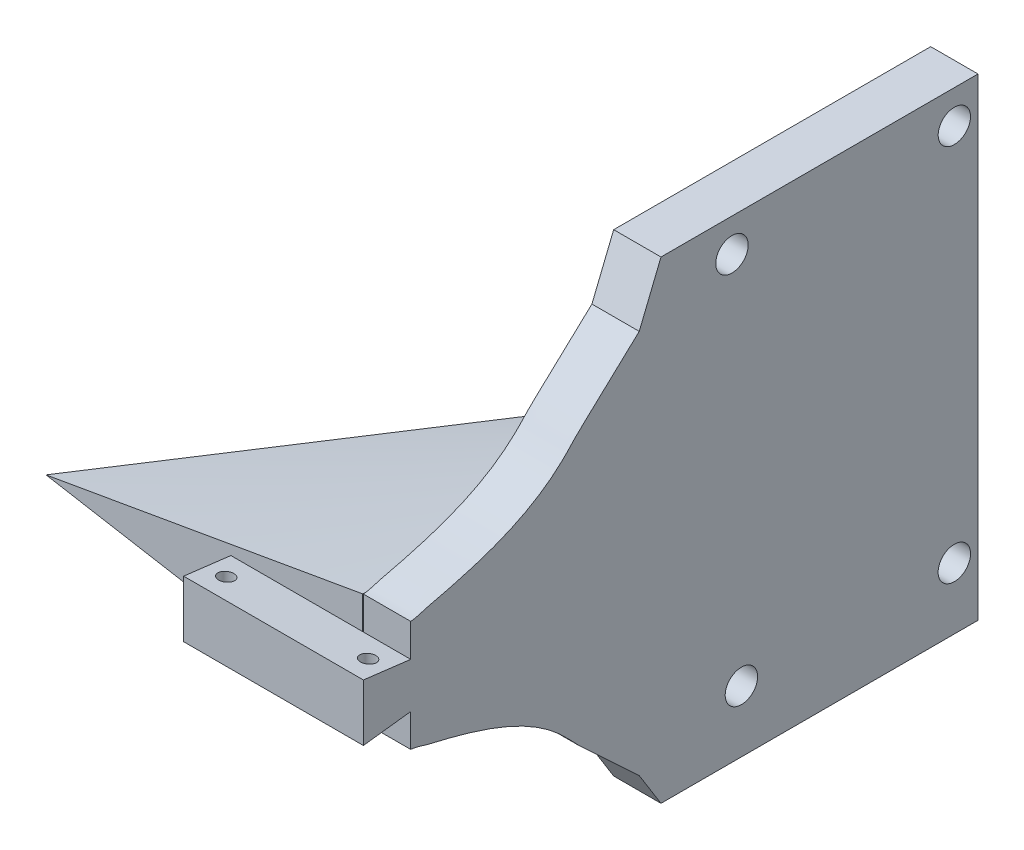
ISO-10303-21;
HEADER;
FILE_DESCRIPTION(('STEP AP214'),'2;1');
FILE_NAME('part.step','',(''),(''),'','','');
FILE_SCHEMA(('AUTOMOTIVE_DESIGN { 1 0 10303 214 1 1 1 1 }'));
ENDSEC;
DATA;
#1=APPLICATION_CONTEXT('core data for automotive mechanical design processes');
#2=APPLICATION_PROTOCOL_DEFINITION('international standard','automotive_design',2000,#1);
#3=PRODUCT_CONTEXT('',#1,'mechanical');
#4=PRODUCT('Part','Part','',(#3));
#5=PRODUCT_RELATED_PRODUCT_CATEGORY('part','',(#4));
#6=PRODUCT_DEFINITION_FORMATION('','',#4);
#7=PRODUCT_DEFINITION_CONTEXT('part definition',#1,'design');
#8=PRODUCT_DEFINITION('design','',#6,#7);
#9=PRODUCT_DEFINITION_SHAPE('','',#8);
#10=(LENGTH_UNIT() NAMED_UNIT(*) SI_UNIT(.MILLI.,.METRE.));
#11=(NAMED_UNIT(*) PLANE_ANGLE_UNIT() SI_UNIT($,.RADIAN.));
#12=(NAMED_UNIT(*) SI_UNIT($,.STERADIAN.) SOLID_ANGLE_UNIT());
#13=UNCERTAINTY_MEASURE_WITH_UNIT(LENGTH_MEASURE(1.E-05),#10,'distance_accuracy_value','');
#14=(GEOMETRIC_REPRESENTATION_CONTEXT(3) GLOBAL_UNCERTAINTY_ASSIGNED_CONTEXT((#13)) GLOBAL_UNIT_ASSIGNED_CONTEXT((#10,
#11,#12)) REPRESENTATION_CONTEXT('',''));
#15=CARTESIAN_POINT('',(0.,0.,0.));
#16=DIRECTION('',(0.,0.,1.));
#17=DIRECTION('',(1.,0.,0.));
#18=AXIS2_PLACEMENT_3D('',#15,#16,#17);
#19=CARTESIAN_POINT('',(-26.8770812291535,4.77215439097134,4.87201612799886E-13));
#20=DIRECTION('',(0.,0.,-1.));
#21=DIRECTION('',(-1.,0.,0.));
#22=AXIS2_PLACEMENT_3D('',#19,#20,#21);
#23=PLANE('',#22);
#24=DIRECTION('',(1.,0.,0.));
#25=VECTOR('',#24,1.);
#26=CARTESIAN_POINT('',(-26.8770812291536,-4.7721543909707,4.86032772079898E-13));
#27=LINE('',#26,#25);
#28=CARTESIAN_POINT('',(0.962918770845578,-4.77215439097103,0.));
#29=VERTEX_POINT('',#28);
#30=CARTESIAN_POINT('',(1.12291877084637,-4.77215439097103,0.));
#31=VERTEX_POINT('',#30);
#32=EDGE_CURVE('E214',#29,#31,#27,.T.);
#33=ORIENTED_EDGE('',*,*,#32,.F.);
#34=DIRECTION('',(0.,1.,0.));
#35=VECTOR('',#34,1.);
#36=CARTESIAN_POINT('',(0.96291877084558,-7.35277027721134,0.));
#37=LINE('',#36,#35);
#38=CARTESIAN_POINT('',(0.962918770845582,4.77215439097101,0.));
#39=VERTEX_POINT('',#38);
#40=EDGE_CURVE('E221',#29,#39,#37,.T.);
#41=ORIENTED_EDGE('',*,*,#40,.T.);
#42=DIRECTION('',(1.,0.,0.));
#43=VECTOR('',#42,1.);
#44=CARTESIAN_POINT('',(-26.8770812291535,4.77215439097134,4.87201612799886E-13));
#45=LINE('',#44,#43);
#46=CARTESIAN_POINT('',(1.12291877084638,4.77215439097101,0.));
#47=VERTEX_POINT('',#46);
#48=EDGE_CURVE('E676',#39,#47,#45,.T.);
#49=ORIENTED_EDGE('',*,*,#48,.T.);
#50=DIRECTION('',(0.,-1.,0.));
#51=VECTOR('',#50,1.);
#52=CARTESIAN_POINT('',(1.12291877084638,-11.7212844616731,0.));
#53=LINE('',#52,#51);
#54=EDGE_CURVE('E574',#47,#31,#53,.T.);
#55=ORIENTED_EDGE('',*,*,#54,.T.);
#56=EDGE_LOOP('',(#33,#41,#49,#55));
#57=FACE_BOUND('',#56,.T.);
#58=ADVANCED_FACE('F201',(#57),#23,.T.);
#59=CARTESIAN_POINT('',(1.12291877084638,-11.7212844616731,0.));
#60=DIRECTION('',(0.,0.,1.));
#61=DIRECTION('',(1.,0.,0.));
#62=AXIS2_PLACEMENT_3D('',#59,#60,#61);
#63=PLANE('',#62);
#64=CARTESIAN_POINT('',(1.12291877084638,11.7212844616731,0.));
#65=VERTEX_POINT('',#64);
#66=EDGE_CURVE('E590',#65,#47,#53,.T.);
#67=ORIENTED_EDGE('',*,*,#66,.T.);
#68=CARTESIAN_POINT('',(11.1229187708464,4.77215439097112,0.));
#69=VERTEX_POINT('',#68);
#70=EDGE_CURVE('E211',#47,#69,#45,.T.);
#71=ORIENTED_EDGE('',*,*,#70,.T.);
#72=DIRECTION('',(0.,-1.,0.));
#73=VECTOR('',#72,1.);
#74=CARTESIAN_POINT('',(11.1229187708464,-11.7212844616731,0.));
#75=LINE('',#74,#73);
#76=CARTESIAN_POINT('',(11.1229187708464,11.7212844616731,0.));
#77=VERTEX_POINT('',#76);
#78=EDGE_CURVE('E572',#77,#69,#75,.T.);
#79=ORIENTED_EDGE('',*,*,#78,.F.);
#80=DIRECTION('',(1.,0.,0.));
#81=VECTOR('',#80,1.);
#82=CARTESIAN_POINT('',(1.12291877084638,11.7212844616731,0.));
#83=LINE('',#82,#81);
#84=EDGE_CURVE('E519',#65,#77,#83,.T.);
#85=ORIENTED_EDGE('',*,*,#84,.F.);
#86=EDGE_LOOP('',(#67,#71,#79,#85));
#87=FACE_BOUND('',#86,.T.);
#88=ADVANCED_FACE('F465',(#87),#63,.T.);
#89=CARTESIAN_POINT('',(11.1229187708464,-4.77215439097115,-2.02794304362982E-13));
#90=VERTEX_POINT('',#89);
#91=EDGE_CURVE('E12',#31,#90,#27,.T.);
#92=ORIENTED_EDGE('',*,*,#91,.F.);
#93=CARTESIAN_POINT('',(1.12291877084638,-11.7212844616731,0.));
#94=VERTEX_POINT('',#93);
#95=EDGE_CURVE('E205',#31,#94,#53,.T.);
#96=ORIENTED_EDGE('',*,*,#95,.T.);
#97=DIRECTION('',(1.,0.,0.));
#98=VECTOR('',#97,1.);
#99=CARTESIAN_POINT('',(1.12291877084638,-11.7212844616731,0.));
#100=LINE('',#99,#98);
#101=CARTESIAN_POINT('',(11.1229187708464,-11.7212844616731,0.));
#102=VERTEX_POINT('',#101);
#103=EDGE_CURVE('E553',#94,#102,#100,.T.);
#104=ORIENTED_EDGE('',*,*,#103,.T.);
#105=EDGE_CURVE('E570',#90,#102,#75,.T.);
#106=ORIENTED_EDGE('',*,*,#105,.F.);
#107=EDGE_LOOP('',(#92,#96,#104,#106));
#108=FACE_BOUND('',#107,.T.);
#109=ADVANCED_FACE('F470',(#108),#63,.T.);
#110=CARTESIAN_POINT('',(1.12291877084604,-40.6534142219299,-48.2960542107961));
#111=DIRECTION('',(0.,-0.528663777933964,0.848831320051628));
#112=DIRECTION('',(0.,-0.848831320051628,-0.528663777933964));
#113=AXIS2_PLACEMENT_3D('',#110,#111,#112);
#114=PLANE('',#113);
#115=CARTESIAN_POINT('',(11.122918770846,-40.6534142219299,-48.2960542107962));
#116=CARTESIAN_POINT('',(11.122918770846,-48.0309105660179,-52.8908600300753));
#117=B_SPLINE_CURVE_WITH_KNOTS('',1,(#115,#116),.UNSPECIFIED.,.F.,.F.,(2,2),(0.,1.),.UNSPECIFIED.);
#118=CARTESIAN_POINT('',(11.122918770846,-40.6534142219299,-48.2960542107962));
#119=VERTEX_POINT('',#118);
#120=CARTESIAN_POINT('',(11.122918770846,-48.0309105660179,-52.8908600300753));
#121=VERTEX_POINT('',#120);
#122=EDGE_CURVE('E569',#119,#121,#117,.T.);
#123=ORIENTED_EDGE('',*,*,#122,.F.);
#124=DIRECTION('',(1.,0.,0.));
#125=VECTOR('',#124,1.);
#126=CARTESIAN_POINT('',(1.12291877084604,-40.6534142219299,-48.2960542107961));
#127=LINE('',#126,#125);
#128=CARTESIAN_POINT('',(1.12291877084604,-40.6534142219299,-48.2960542107961));
#129=VERTEX_POINT('',#128);
#130=EDGE_CURVE('E520',#129,#119,#127,.T.);
#131=ORIENTED_EDGE('',*,*,#130,.F.);
#132=CARTESIAN_POINT('',(1.12291877084604,-40.6534142219299,-48.2960542107961));
#133=CARTESIAN_POINT('',(1.12291877084601,-48.0309105660179,-52.8908600300753));
#134=B_SPLINE_CURVE_WITH_KNOTS('',1,(#132,#133),.UNSPECIFIED.,.F.,.F.,(2,2),(0.,1.),.UNSPECIFIED.);
#135=CARTESIAN_POINT('',(1.12291877084601,-48.0309105660179,-52.8908600300753));
#136=VERTEX_POINT('',#135);
#137=EDGE_CURVE('E547',#129,#136,#134,.T.);
#138=ORIENTED_EDGE('',*,*,#137,.T.);
#139=DIRECTION('',(1.,0.,0.));
#140=VECTOR('',#139,1.);
#141=CARTESIAN_POINT('',(1.12291877084601,-48.0309105660179,-52.8908600300753));
#142=LINE('',#141,#140);
#143=EDGE_CURVE('E552',#136,#121,#142,.T.);
#144=ORIENTED_EDGE('',*,*,#143,.T.);
#145=EDGE_LOOP('',(#123,#131,#138,#144));
#146=FACE_BOUND('',#145,.T.);
#147=ADVANCED_FACE('F486',(#146),#114,.T.);
#148=CARTESIAN_POINT('',(1.12291877084638,-11.7212844616731,0.));
#149=CARTESIAN_POINT('',(1.12291877084637,-11.7957609670483,-1.05679071993206));
#150=CARTESIAN_POINT('',(1.12291877084635,-12.5699102613416,-3.1771284252955));
#151=CARTESIAN_POINT('',(1.12291877084633,-13.1768755470558,-6.12985224905279));
#152=CARTESIAN_POINT('',(1.12291877084631,-13.9662185926524,-9.12701697723162));
#153=CARTESIAN_POINT('',(1.12291877084629,-14.7533805583197,-12.0029771518105));
#154=CARTESIAN_POINT('',(1.12291877084627,-15.7871285152694,-15.3317991784619));
#155=CARTESIAN_POINT('',(1.12291877084624,-16.9873063128013,-18.6813386409453));
#156=CARTESIAN_POINT('',(1.12291877084622,-18.4328433633397,-22.0422962994874));
#157=CARTESIAN_POINT('',(1.1229187708462,-19.9461704242026,-24.9711880695502));
#158=CARTESIAN_POINT('',(1.12291877084618,-21.6631883448909,-27.7573050798041));
#159=CARTESIAN_POINT('',(1.12291877084616,-23.7179455810989,-30.5385992974575));
#160=CARTESIAN_POINT('',(1.12291877084614,-26.1629483635974,-33.1168346807232));
#161=CARTESIAN_POINT('',(1.12291877084613,-28.624744086619,-35.3202312972234));
#162=CARTESIAN_POINT('',(1.12291877084611,-30.6908829245273,-37.6358415487435));
#163=CARTESIAN_POINT('',(1.12291877084608,-34.7138484719793,-41.8971248216837));
#164=CARTESIAN_POINT('',(1.12291877084606,-38.0418687131716,-45.5238594041665));
#165=CARTESIAN_POINT('',(1.12291877084604,-40.6534142219299,-48.2960542107961));
#166=B_SPLINE_CURVE_WITH_KNOTS('',3,(#148,#149,#150,#151,#152,#153,#154,#155,#156,#157,#158,
#159,#160,#161,#162,#163,#164,#165),.UNSPECIFIED.,.F.,.F.,(4,1,1,1,1,1,1,1,1,1,1,1,1,1,1,4),(0.,
0.0547764379884916,0.113684498778145,0.155511464198572,0.213946507466747,0.266998103481297,
0.334647937930746,0.396759471953919,0.454940857044665,0.503949026546772,0.564878370917525,
0.632336278952794,0.68620976969534,0.734567942488069,0.791707336132139,0.98752495134111),.UNSPECIFIED.);
#167=DIRECTION('',(1.,0.,0.));
#168=VECTOR('',#167,1.);
#169=SURFACE_OF_LINEAR_EXTRUSION('',#166,#168);
#170=CARTESIAN_POINT('',(11.1229187708464,-11.7212844616731,0.));
#171=CARTESIAN_POINT('',(11.1229187708464,-11.7957609670483,-1.05679071993212));
#172=CARTESIAN_POINT('',(11.1229187708464,-12.5699102613416,-3.17712842529557));
#173=CARTESIAN_POINT('',(11.1229187708463,-13.1768755470558,-6.12985224905286));
#174=CARTESIAN_POINT('',(11.1229187708463,-13.9662185926524,-9.12701697723169));
#175=CARTESIAN_POINT('',(11.1229187708463,-14.7533805583197,-12.0029771518106));
#176=CARTESIAN_POINT('',(11.1229187708463,-15.7871285152694,-15.3317991784619));
#177=CARTESIAN_POINT('',(11.1229187708462,-16.9873063128013,-18.6813386409454));
#178=CARTESIAN_POINT('',(11.1229187708462,-18.4328433633397,-22.0422962994875));
#179=CARTESIAN_POINT('',(11.1229187708462,-19.9461704242026,-24.9711880695503));
#180=CARTESIAN_POINT('',(11.1229187708462,-21.6631883448909,-27.7573050798042));
#181=CARTESIAN_POINT('',(11.1229187708462,-23.7179455810989,-30.5385992974575));
#182=CARTESIAN_POINT('',(11.1229187708461,-26.1629483635974,-33.1168346807232));
#183=CARTESIAN_POINT('',(11.1229187708461,-28.624744086619,-35.3202312972235));
#184=CARTESIAN_POINT('',(11.1229187708461,-30.6908829245273,-37.6358415487435));
#185=CARTESIAN_POINT('',(11.1229187708461,-34.7138484719793,-41.8971248216837));
#186=CARTESIAN_POINT('',(11.1229187708461,-38.0418687131716,-45.5238594041665));
#187=CARTESIAN_POINT('',(11.122918770846,-40.6534142219299,-48.2960542107962));
#188=B_SPLINE_CURVE_WITH_KNOTS('',3,(#170,#171,#172,#173,#174,#175,#176,#177,#178,#179,#180,
#181,#182,#183,#184,#185,#186,#187),.UNSPECIFIED.,.F.,.F.,(4,1,1,1,1,1,1,1,1,1,1,1,1,1,1,4),(0.,
0.0547764379884916,0.113684498778145,0.155511464198572,0.213946507466747,0.266998103481297,
0.334647937930746,0.396759471953919,0.454940857044665,0.503949026546772,0.564878370917525,
0.632336278952794,0.68620976969534,0.734567942488069,0.791707336132139,0.98752495134111),.UNSPECIFIED.);
#189=EDGE_CURVE('E578',#102,#119,#188,.T.);
#190=ORIENTED_EDGE('',*,*,#189,.F.);
#191=ORIENTED_EDGE('',*,*,#103,.F.);
#192=EDGE_CURVE('E593',#94,#129,#166,.T.);
#193=ORIENTED_EDGE('',*,*,#192,.T.);
#194=ORIENTED_EDGE('',*,*,#130,.T.);
#195=EDGE_LOOP('',(#190,#191,#193,#194));
#196=FACE_BOUND('',#195,.T.);
#197=ADVANCED_FACE('F489',(#196),#169,.T.);
#198=CARTESIAN_POINT('',(1.12291877084604,40.6534142219299,-48.2960542107961));
#199=CARTESIAN_POINT('',(1.12291877084606,38.0418687131716,-45.5238594041664));
#200=CARTESIAN_POINT('',(1.12291877084608,34.7138484719793,-41.8971248216837));
#201=CARTESIAN_POINT('',(1.12291877084611,30.6908829245273,-37.6358415487434));
#202=CARTESIAN_POINT('',(1.12291877084613,28.624744086619,-35.3202312972234));
#203=CARTESIAN_POINT('',(1.12291877084614,26.1629483635974,-33.1168346807231));
#204=CARTESIAN_POINT('',(1.12291877084616,23.7179455810989,-30.5385992974574));
#205=CARTESIAN_POINT('',(1.12291877084618,21.6631883448909,-27.7573050798041));
#206=CARTESIAN_POINT('',(1.1229187708462,19.9461704242026,-24.9711880695502));
#207=CARTESIAN_POINT('',(1.12291877084622,18.4328433633397,-22.0422962994873));
#208=CARTESIAN_POINT('',(1.12291877084624,16.9873063128013,-18.6813386409453));
#209=CARTESIAN_POINT('',(1.12291877084627,15.7871285152694,-15.3317991784619));
#210=CARTESIAN_POINT('',(1.12291877084629,14.7533805583198,-12.0029771518105));
#211=CARTESIAN_POINT('',(1.12291877084631,13.9662185926524,-9.12701697723162));
#212=CARTESIAN_POINT('',(1.12291877084633,13.1768755470558,-6.12985224905278));
#213=CARTESIAN_POINT('',(1.12291877084635,12.5699102613416,-3.17712842529548));
#214=CARTESIAN_POINT('',(1.12291877084637,11.7957609670483,-1.05679071993204));
#215=CARTESIAN_POINT('',(1.12291877084638,11.7212844616731,0.));
#216=B_SPLINE_CURVE_WITH_KNOTS('',3,(#198,#199,#200,#201,#202,#203,#204,#205,#206,#207,#208,
#209,#210,#211,#212,#213,#214,#215),.UNSPECIFIED.,.F.,.F.,(4,1,1,1,1,1,1,1,1,1,1,1,1,1,1,4),(0.,
0.195817615208971,0.252957008853041,0.30131518164577,0.355188672388316,0.422646580423585,
0.483575924794339,0.532584094296445,0.590765479387194,0.652877013410364,0.720526847859813,
0.773578443874362,0.832013487142538,0.873840452562965,0.932748513352618,0.98752495134111),.UNSPECIFIED.);
#217=DIRECTION('',(1.,0.,0.));
#218=VECTOR('',#217,1.);
#219=SURFACE_OF_LINEAR_EXTRUSION('',#216,#218);
#220=CARTESIAN_POINT('',(11.122918770846,40.6534142219299,-48.2960542107962));
#221=CARTESIAN_POINT('',(11.1229187708461,38.0418687131716,-45.5238594041665));
#222=CARTESIAN_POINT('',(11.1229187708461,34.7138484719793,-41.8971248216837));
#223=CARTESIAN_POINT('',(11.1229187708461,30.6908829245273,-37.6358415487435));
#224=CARTESIAN_POINT('',(11.1229187708461,28.624744086619,-35.3202312972235));
#225=CARTESIAN_POINT('',(11.1229187708461,26.1629483635974,-33.1168346807232));
#226=CARTESIAN_POINT('',(11.1229187708462,23.7179455810989,-30.5385992974575));
#227=CARTESIAN_POINT('',(11.1229187708462,21.6631883448909,-27.7573050798042));
#228=CARTESIAN_POINT('',(11.1229187708462,19.9461704242026,-24.9711880695502));
#229=CARTESIAN_POINT('',(11.1229187708462,18.4328433633397,-22.0422962994874));
#230=CARTESIAN_POINT('',(11.1229187708462,16.9873063128013,-18.6813386409454));
#231=CARTESIAN_POINT('',(11.1229187708463,15.7871285152694,-15.3317991784619));
#232=CARTESIAN_POINT('',(11.1229187708463,14.7533805583198,-12.0029771518106));
#233=CARTESIAN_POINT('',(11.1229187708463,13.9662185926524,-9.12701697723169));
#234=CARTESIAN_POINT('',(11.1229187708463,13.1768755470558,-6.12985224905285));
#235=CARTESIAN_POINT('',(11.1229187708464,12.5699102613416,-3.17712842529555));
#236=CARTESIAN_POINT('',(11.1229187708464,11.7957609670483,-1.05679071993211));
#237=CARTESIAN_POINT('',(11.1229187708464,11.7212844616731,0.));
#238=B_SPLINE_CURVE_WITH_KNOTS('',3,(#220,#221,#222,#223,#224,#225,#226,#227,#228,#229,#230,
#231,#232,#233,#234,#235,#236,#237),.UNSPECIFIED.,.F.,.F.,(4,1,1,1,1,1,1,1,1,1,1,1,1,1,1,4),(0.,
0.195817615208971,0.252957008853041,0.30131518164577,0.355188672388316,0.422646580423585,
0.483575924794339,0.532584094296445,0.590765479387194,0.652877013410364,0.720526847859813,
0.773578443874362,0.832013487142538,0.873840452562965,0.932748513352618,0.98752495134111),.UNSPECIFIED.);
#239=CARTESIAN_POINT('',(11.122918770846,40.6534142219299,-48.2960542107962));
#240=VERTEX_POINT('',#239);
#241=EDGE_CURVE('E573',#240,#77,#238,.T.);
#242=ORIENTED_EDGE('',*,*,#241,.F.);
#243=DIRECTION('',(1.,0.,0.));
#244=VECTOR('',#243,1.);
#245=CARTESIAN_POINT('',(1.12291877084604,40.6534142219299,-48.2960542107961));
#246=LINE('',#245,#244);
#247=CARTESIAN_POINT('',(1.12291877084604,40.6534142219299,-48.2960542107961));
#248=VERTEX_POINT('',#247);
#249=EDGE_CURVE('E531',#248,#240,#246,.T.);
#250=ORIENTED_EDGE('',*,*,#249,.F.);
#251=EDGE_CURVE('E513',#248,#65,#216,.T.);
#252=ORIENTED_EDGE('',*,*,#251,.T.);
#253=ORIENTED_EDGE('',*,*,#84,.T.);
#254=EDGE_LOOP('',(#242,#250,#252,#253));
#255=FACE_BOUND('',#254,.T.);
#256=ADVANCED_FACE('F507',(#255),#219,.T.);
#257=CARTESIAN_POINT('',(1.12291877084601,51.9690894339821,-52.8908600300753));
#258=DIRECTION('',(0.,0.376223320622477,0.9265290135877));
#259=DIRECTION('',(0.,-0.9265290135877,0.376223320622477));
#260=AXIS2_PLACEMENT_3D('',#257,#258,#259);
#261=PLANE('',#260);
#262=CARTESIAN_POINT('',(11.122918770846,51.9690894339821,-52.8908600300753));
#263=CARTESIAN_POINT('',(11.122918770846,40.6534142219299,-48.2960542107962));
#264=B_SPLINE_CURVE_WITH_KNOTS('',1,(#262,#263),.UNSPECIFIED.,.F.,.F.,(2,2),(0.,1.),.UNSPECIFIED.);
#265=CARTESIAN_POINT('',(11.122918770846,51.9690894339821,-52.8908600300753));
#266=VERTEX_POINT('',#265);
#267=EDGE_CURVE('E734',#266,#240,#264,.T.);
#268=ORIENTED_EDGE('',*,*,#267,.F.);
#269=DIRECTION('',(1.,0.,0.));
#270=VECTOR('',#269,1.);
#271=CARTESIAN_POINT('',(1.12291877084601,51.9690894339821,-52.8908600300753));
#272=LINE('',#271,#270);
#273=CARTESIAN_POINT('',(1.12291877084601,51.9690894339821,-52.8908600300753));
#274=VERTEX_POINT('',#273);
#275=EDGE_CURVE('E538',#274,#266,#272,.T.);
#276=ORIENTED_EDGE('',*,*,#275,.F.);
#277=CARTESIAN_POINT('',(1.12291877084601,51.9690894339821,-52.8908600300753));
#278=CARTESIAN_POINT('',(1.12291877084604,40.6534142219299,-48.2960542107961));
#279=B_SPLINE_CURVE_WITH_KNOTS('',1,(#277,#278),.UNSPECIFIED.,.F.,.F.,(2,2),(0.,1.),.UNSPECIFIED.);
#280=EDGE_CURVE('E523',#274,#248,#279,.T.);
#281=ORIENTED_EDGE('',*,*,#280,.T.);
#282=ORIENTED_EDGE('',*,*,#249,.T.);
#283=EDGE_LOOP('',(#268,#276,#281,#282));
#284=FACE_BOUND('',#283,.T.);
#285=ADVANCED_FACE('F503',(#284),#261,.T.);
#286=CARTESIAN_POINT('',(1.12291877084554,51.9690894339821,-119.890860030075));
#287=DIRECTION('',(0.,1.,0.));
#288=DIRECTION('',(0.,0.,1.));
#289=AXIS2_PLACEMENT_3D('',#286,#287,#288);
#290=PLANE('',#289);
#291=DIRECTION('',(0.,0.,1.));
#292=VECTOR('',#291,1.);
#293=CARTESIAN_POINT('',(11.1229187708455,51.9690894339821,-119.890860030075));
#294=LINE('',#293,#292);
#295=CARTESIAN_POINT('',(11.1229187708455,51.9690894339821,-119.890860030075));
#296=VERTEX_POINT('',#295);
#297=EDGE_CURVE('E738',#296,#266,#294,.T.);
#298=ORIENTED_EDGE('',*,*,#297,.F.);
#299=DIRECTION('',(1.,0.,0.));
#300=VECTOR('',#299,1.);
#301=CARTESIAN_POINT('',(1.12291877084554,51.9690894339821,-119.890860030075));
#302=LINE('',#301,#300);
#303=CARTESIAN_POINT('',(1.12291877084554,51.9690894339821,-119.890860030075));
#304=VERTEX_POINT('',#303);
#305=EDGE_CURVE('E542',#304,#296,#302,.T.);
#306=ORIENTED_EDGE('',*,*,#305,.F.);
#307=DIRECTION('',(0.,0.,1.));
#308=VECTOR('',#307,1.);
#309=CARTESIAN_POINT('',(1.12291877084554,51.9690894339821,-119.890860030075));
#310=LINE('',#309,#308);
#311=EDGE_CURVE('E532',#304,#274,#310,.T.);
#312=ORIENTED_EDGE('',*,*,#311,.T.);
#313=ORIENTED_EDGE('',*,*,#275,.T.);
#314=EDGE_LOOP('',(#298,#306,#312,#313));
#315=FACE_BOUND('',#314,.T.);
#316=ADVANCED_FACE('F499',(#315),#290,.T.);
#317=CARTESIAN_POINT('',(1.12291877084554,51.9690894339821,-119.890860030075));
#318=DIRECTION('',(0.,0.,-1.));
#319=DIRECTION('',(-1.,0.,0.));
#320=AXIS2_PLACEMENT_3D('',#317,#318,#319);
#321=PLANE('',#320);
#322=DIRECTION('',(0.,1.,0.));
#323=VECTOR('',#322,1.);
#324=CARTESIAN_POINT('',(11.1229187708455,51.9690894339821,-119.890860030075));
#325=LINE('',#324,#323);
#326=CARTESIAN_POINT('',(11.1229187708455,-48.0309105660179,-119.890860030075));
#327=VERTEX_POINT('',#326);
#328=EDGE_CURVE('E741',#327,#296,#325,.T.);
#329=ORIENTED_EDGE('',*,*,#328,.F.);
#330=DIRECTION('',(1.,0.,0.));
#331=VECTOR('',#330,1.);
#332=CARTESIAN_POINT('',(1.12291877084554,-48.0309105660179,-119.890860030075));
#333=LINE('',#332,#331);
#334=CARTESIAN_POINT('',(1.12291877084554,-48.0309105660179,-119.890860030075));
#335=VERTEX_POINT('',#334);
#336=EDGE_CURVE('E546',#335,#327,#333,.T.);
#337=ORIENTED_EDGE('',*,*,#336,.F.);
#338=DIRECTION('',(0.,1.,0.));
#339=VECTOR('',#338,1.);
#340=CARTESIAN_POINT('',(1.12291877084554,51.9690894339821,-119.890860030075));
#341=LINE('',#340,#339);
#342=EDGE_CURVE('E539',#335,#304,#341,.T.);
#343=ORIENTED_EDGE('',*,*,#342,.T.);
#344=ORIENTED_EDGE('',*,*,#305,.T.);
#345=EDGE_LOOP('',(#329,#337,#343,#344));
#346=FACE_BOUND('',#345,.T.);
#347=ADVANCED_FACE('F495',(#346),#321,.T.);
#348=CARTESIAN_POINT('',(1.12291877084554,-48.0309105660179,-119.890860030075));
#349=DIRECTION('',(0.,-1.,0.));
#350=DIRECTION('',(1.,0.,0.));
#351=AXIS2_PLACEMENT_3D('',#348,#349,#350);
#352=PLANE('',#351);
#353=DIRECTION('',(0.,0.,-1.));
#354=VECTOR('',#353,1.);
#355=CARTESIAN_POINT('',(11.1229187708455,-48.0309105660179,-119.890860030075));
#356=LINE('',#355,#354);
#357=EDGE_CURVE('E657',#121,#327,#356,.T.);
#358=ORIENTED_EDGE('',*,*,#357,.F.);
#359=ORIENTED_EDGE('',*,*,#143,.F.);
#360=DIRECTION('',(0.,0.,-1.));
#361=VECTOR('',#360,1.);
#362=CARTESIAN_POINT('',(1.12291877084554,-48.0309105660179,-119.890860030075));
#363=LINE('',#362,#361);
#364=EDGE_CURVE('E543',#136,#335,#363,.T.);
#365=ORIENTED_EDGE('',*,*,#364,.T.);
#366=ORIENTED_EDGE('',*,*,#336,.T.);
#367=EDGE_LOOP('',(#358,#359,#365,#366));
#368=FACE_BOUND('',#367,.T.);
#369=ADVANCED_FACE('F491',(#368),#352,.T.);
#370=CARTESIAN_POINT('',(1.12291877084619,21.2444584192039,-27.0434474597605));
#371=DIRECTION('',(1.,0.,0.));
#372=DIRECTION('',(0.,0.,-1.));
#373=AXIS2_PLACEMENT_3D('',#370,#371,#372);
#374=PLANE('',#373);
#375=CARTESIAN_POINT('',(1.12291877084393,-35.0309105360178,-114.890860030075));
#376=DIRECTION('',(1.,0.,0.));
#377=DIRECTION('',(0.,0.,-1.));
#378=AXIS2_PLACEMENT_3D('',#375,#376,#377);
#379=CIRCLE('',#378,3.429);
#380=CARTESIAN_POINT('',(1.12291877084387,-35.0309105360178,-118.319860030075));
#381=VERTEX_POINT('',#380);
#382=EDGE_CURVE('E554',#381,#381,#379,.T.);
#383=ORIENTED_EDGE('',*,*,#382,.T.);
#384=EDGE_LOOP('',(#383));
#385=FACE_BOUND('',#384,.T.);
#386=CARTESIAN_POINT('',(1.12291877084574,44.9690894639822,-67.8908600300753));
#387=DIRECTION('',(1.,0.,0.));
#388=DIRECTION('',(0.,0.,-1.));
#389=AXIS2_PLACEMENT_3D('',#386,#387,#388);
#390=CIRCLE('',#389,3.429);
#391=CARTESIAN_POINT('',(1.12291877084567,44.9690894639822,-71.3198600300753));
#392=VERTEX_POINT('',#391);
#393=EDGE_CURVE('E560',#392,#392,#390,.T.);
#394=ORIENTED_EDGE('',*,*,#393,.T.);
#395=EDGE_LOOP('',(#394));
#396=FACE_BOUND('',#395,.T.);
#397=CARTESIAN_POINT('',(1.12291877084475,-35.0309105360178,-69.8908600300753));
#398=DIRECTION('',(1.,0.,0.));
#399=DIRECTION('',(0.,0.,-1.));
#400=AXIS2_PLACEMENT_3D('',#397,#398,#399);
#401=CIRCLE('',#400,3.429);
#402=CARTESIAN_POINT('',(1.12291877084469,-35.0309105360178,-73.3198600300753));
#403=VERTEX_POINT('',#402);
#404=EDGE_CURVE('E563',#403,#403,#401,.T.);
#405=ORIENTED_EDGE('',*,*,#404,.T.);
#406=EDGE_LOOP('',(#405));
#407=FACE_BOUND('',#406,.T.);
#408=CARTESIAN_POINT('',(1.12291877084487,44.9690894639822,-114.890860030075));
#409=DIRECTION('',(1.,0.,0.));
#410=DIRECTION('',(0.,0.,-1.));
#411=AXIS2_PLACEMENT_3D('',#408,#409,#410);
#412=CIRCLE('',#411,3.415);
#413=CARTESIAN_POINT('',(1.12291877084481,44.9690894639822,-118.305860030075));
#414=VERTEX_POINT('',#413);
#415=EDGE_CURVE('E566',#414,#414,#412,.T.);
#416=ORIENTED_EDGE('',*,*,#415,.T.);
#417=EDGE_LOOP('',(#416));
#418=FACE_BOUND('',#417,.T.);
#419=ORIENTED_EDGE('',*,*,#137,.F.);
#420=ORIENTED_EDGE('',*,*,#192,.F.);
#421=ORIENTED_EDGE('',*,*,#95,.F.);
#422=ORIENTED_EDGE('',*,*,#54,.F.);
#423=ORIENTED_EDGE('',*,*,#66,.F.);
#424=ORIENTED_EDGE('',*,*,#251,.F.);
#425=ORIENTED_EDGE('',*,*,#280,.F.);
#426=ORIENTED_EDGE('',*,*,#311,.F.);
#427=ORIENTED_EDGE('',*,*,#342,.F.);
#428=ORIENTED_EDGE('',*,*,#364,.F.);
#429=EDGE_LOOP('',(#419,#420,#421,#422,#423,#424,#425,#426,#427,#428));
#430=FACE_BOUND('',#429,.T.);
#431=ADVANCED_FACE('F494',(#385,#396,#407,#418,#430),#374,.F.);
#432=CARTESIAN_POINT('',(11.1229187708462,21.2444584192039,-27.0434474597606));
#433=DIRECTION('',(1.,0.,0.));
#434=DIRECTION('',(0.,0.,-1.));
#435=AXIS2_PLACEMENT_3D('',#432,#433,#434);
#436=PLANE('',#435);
#437=CARTESIAN_POINT('',(11.1229187708439,-35.0309105360179,-114.890860030075));
#438=DIRECTION('',(1.,0.,0.));
#439=DIRECTION('',(0.,0.,-1.));
#440=AXIS2_PLACEMENT_3D('',#437,#438,#439);
#441=CIRCLE('',#440,3.429);
#442=CARTESIAN_POINT('',(11.1229187708439,-35.0309105360179,-118.319860030075));
#443=VERTEX_POINT('',#442);
#444=EDGE_CURVE('E639',#443,#443,#441,.T.);
#445=ORIENTED_EDGE('',*,*,#444,.F.);
#446=EDGE_LOOP('',(#445));
#447=FACE_BOUND('',#446,.T.);
#448=CARTESIAN_POINT('',(11.1229187708457,44.9690894639821,-67.8908600300755));
#449=DIRECTION('',(1.,0.,0.));
#450=DIRECTION('',(0.,0.,-1.));
#451=AXIS2_PLACEMENT_3D('',#448,#449,#450);
#452=CIRCLE('',#451,3.429);
#453=CARTESIAN_POINT('',(11.1229187708457,44.9690894639821,-71.3198600300755));
#454=VERTEX_POINT('',#453);
#455=EDGE_CURVE('E665',#454,#454,#452,.T.);
#456=ORIENTED_EDGE('',*,*,#455,.F.);
#457=EDGE_LOOP('',(#456));
#458=FACE_BOUND('',#457,.T.);
#459=CARTESIAN_POINT('',(11.1229187708447,-35.0309105360179,-69.8908600300755));
#460=DIRECTION('',(1.,0.,0.));
#461=DIRECTION('',(0.,0.,-1.));
#462=AXIS2_PLACEMENT_3D('',#459,#460,#461);
#463=CIRCLE('',#462,3.429);
#464=CARTESIAN_POINT('',(11.1229187708447,-35.0309105360179,-73.3198600300755));
#465=VERTEX_POINT('',#464);
#466=EDGE_CURVE('E662',#465,#465,#463,.T.);
#467=ORIENTED_EDGE('',*,*,#466,.F.);
#468=EDGE_LOOP('',(#467));
#469=FACE_BOUND('',#468,.T.);
#470=CARTESIAN_POINT('',(11.1229187708449,44.9690894639821,-114.890860030075));
#471=DIRECTION('',(1.,0.,0.));
#472=DIRECTION('',(0.,0.,-1.));
#473=AXIS2_PLACEMENT_3D('',#470,#471,#472);
#474=CIRCLE('',#473,3.415);
#475=CARTESIAN_POINT('',(11.1229187708448,44.9690894639821,-118.305860030075));
#476=VERTEX_POINT('',#475);
#477=EDGE_CURVE('E660',#476,#476,#474,.T.);
#478=ORIENTED_EDGE('',*,*,#477,.F.);
#479=EDGE_LOOP('',(#478));
#480=FACE_BOUND('',#479,.T.);
#481=ORIENTED_EDGE('',*,*,#122,.T.);
#482=ORIENTED_EDGE('',*,*,#357,.T.);
#483=ORIENTED_EDGE('',*,*,#328,.T.);
#484=ORIENTED_EDGE('',*,*,#297,.T.);
#485=ORIENTED_EDGE('',*,*,#267,.T.);
#486=ORIENTED_EDGE('',*,*,#241,.T.);
#487=ORIENTED_EDGE('',*,*,#78,.T.);
#488=DIRECTION('',(0.,0.121869343405141,0.992546151641323));
#489=VECTOR('',#488,1.);
#490=CARTESIAN_POINT('',(11.1229187708467,5.99999999999987,9.9999999999998));
#491=LINE('',#490,#489);
#492=CARTESIAN_POINT('',(11.1229187708467,5.99999999999987,9.9999999999998));
#493=VERTEX_POINT('',#492);
#494=EDGE_CURVE('E334',#69,#493,#491,.T.);
#495=ORIENTED_EDGE('',*,*,#494,.T.);
#496=DIRECTION('',(0.,-1.,0.));
#497=VECTOR('',#496,1.);
#498=CARTESIAN_POINT('',(11.1229187708465,-6.00000000000013,9.9999999999998));
#499=LINE('',#498,#497);
#500=CARTESIAN_POINT('',(11.1229187708465,-6.00000000000013,9.9999999999998));
#501=VERTEX_POINT('',#500);
#502=EDGE_CURVE('E682',#493,#501,#499,.T.);
#503=ORIENTED_EDGE('',*,*,#502,.T.);
#504=DIRECTION('',(0.,0.121869343405141,-0.992546151641323));
#505=VECTOR('',#504,1.);
#506=CARTESIAN_POINT('',(11.1229187708465,-6.00000000000013,9.9999999999998));
#507=LINE('',#506,#505);
#508=EDGE_CURVE('E679',#501,#90,#507,.T.);
#509=ORIENTED_EDGE('',*,*,#508,.T.);
#510=ORIENTED_EDGE('',*,*,#105,.T.);
#511=ORIENTED_EDGE('',*,*,#189,.T.);
#512=EDGE_LOOP('',(#481,#482,#483,#484,#485,#486,#487,#495,#503,#509,#510,#511));
#513=FACE_BOUND('',#512,.T.);
#514=ADVANCED_FACE('F618',(#447,#458,#469,#480,#513),#436,.T.);
#515=CARTESIAN_POINT('',(-66.3511244602257,44.969089463983,-114.890860030074));
#516=DIRECTION('',(1.,0.,0.));
#517=DIRECTION('',(0.,0.,-1.));
#518=AXIS2_PLACEMENT_3D('',#515,#516,#517);
#519=CYLINDRICAL_SURFACE('',#518,3.415);
#520=ORIENTED_EDGE('',*,*,#477,.T.);
#521=EDGE_LOOP('',(#520));
#522=FACE_BOUND('',#521,.T.);
#523=ORIENTED_EDGE('',*,*,#415,.F.);
#524=EDGE_LOOP('',(#523));
#525=FACE_BOUND('',#524,.T.);
#526=ADVANCED_FACE('F621',(#522,#525),#519,.F.);
#527=CARTESIAN_POINT('',(-66.3511244602258,-35.030910536017,-69.8908600300741));
#528=DIRECTION('',(1.,0.,0.));
#529=DIRECTION('',(0.,0.,-1.));
#530=AXIS2_PLACEMENT_3D('',#527,#528,#529);
#531=CYLINDRICAL_SURFACE('',#530,3.429);
#532=ORIENTED_EDGE('',*,*,#466,.T.);
#533=EDGE_LOOP('',(#532));
#534=FACE_BOUND('',#533,.T.);
#535=ORIENTED_EDGE('',*,*,#404,.F.);
#536=EDGE_LOOP('',(#535));
#537=FACE_BOUND('',#536,.T.);
#538=ADVANCED_FACE('F203',(#534,#537),#531,.F.);
#539=CARTESIAN_POINT('',(-66.3511244602249,44.969089463983,-67.8908600300741));
#540=DIRECTION('',(1.,0.,0.));
#541=DIRECTION('',(0.,0.,-1.));
#542=AXIS2_PLACEMENT_3D('',#539,#540,#541);
#543=CYLINDRICAL_SURFACE('',#542,3.429);
#544=ORIENTED_EDGE('',*,*,#455,.T.);
#545=EDGE_LOOP('',(#544));
#546=FACE_BOUND('',#545,.T.);
#547=ORIENTED_EDGE('',*,*,#393,.F.);
#548=EDGE_LOOP('',(#547));
#549=FACE_BOUND('',#548,.T.);
#550=ADVANCED_FACE('F629',(#546,#549),#543,.F.);
#551=CARTESIAN_POINT('',(-66.3511244602267,-35.030910536017,-114.890860030074));
#552=DIRECTION('',(1.,0.,0.));
#553=DIRECTION('',(0.,0.,-1.));
#554=AXIS2_PLACEMENT_3D('',#551,#552,#553);
#555=CYLINDRICAL_SURFACE('',#554,3.429);
#556=ORIENTED_EDGE('',*,*,#444,.T.);
#557=EDGE_LOOP('',(#556));
#558=FACE_BOUND('',#557,.T.);
#559=ORIENTED_EDGE('',*,*,#382,.F.);
#560=EDGE_LOOP('',(#559));
#561=FACE_BOUND('',#560,.T.);
#562=ADVANCED_FACE('F484',(#558,#561),#555,.F.);
#563=CARTESIAN_POINT('',(-26.8770812291533,6.00000000000032,10.0000000000005));
#564=DIRECTION('',(0.,0.992546151641323,-0.121869343405141));
#565=DIRECTION('',(0.,0.121869343405141,0.992546151641323));
#566=AXIS2_PLACEMENT_3D('',#563,#564,#565);
#567=PLANE('',#566);
#568=CARTESIAN_POINT('',(-22.8770812291533,5.38607719548571,4.99999999999986));
#569=DIRECTION('',(0.,0.992546151641323,-0.121869343405141));
#570=DIRECTION('',(0.,-0.121869343405141,-0.992546151641323));
#571=AXIS2_PLACEMENT_3D('',#568,#569,#570);
#572=ELLIPSE('',#571,1.61201572073416,1.6);
#573=CARTESIAN_POINT('',(-22.8770812291532,5.18962189804107,3.39999999999986));
#574=VERTEX_POINT('',#573);
#575=EDGE_CURVE('E345',#574,#574,#572,.T.);
#576=ORIENTED_EDGE('',*,*,#575,.F.);
#577=EDGE_LOOP('',(#576));
#578=FACE_BOUND('',#577,.T.);
#579=CARTESIAN_POINT('',(7.12291877084668,5.38607719548542,4.99999999999986));
#580=DIRECTION('',(0.,0.992546151641323,-0.121869343405141));
#581=DIRECTION('',(0.,-0.121869343405141,-0.992546151641323));
#582=AXIS2_PLACEMENT_3D('',#579,#580,#581);
#583=ELLIPSE('',#582,1.61201572073416,1.6);
#584=CARTESIAN_POINT('',(7.12291877084681,5.18962189804079,3.39999999999986));
#585=VERTEX_POINT('',#584);
#586=EDGE_CURVE('E888',#585,#585,#583,.T.);
#587=ORIENTED_EDGE('',*,*,#586,.F.);
#588=EDGE_LOOP('',(#587));
#589=FACE_BOUND('',#588,.T.);
#590=ORIENTED_EDGE('',*,*,#494,.F.);
#591=ORIENTED_EDGE('',*,*,#70,.F.);
#592=ORIENTED_EDGE('',*,*,#48,.F.);
#593=CARTESIAN_POINT('',(-26.8770812291535,4.77215439097134,4.86448488364737E-13));
#594=VERTEX_POINT('',#593);
#595=EDGE_CURVE('E677',#594,#39,#45,.T.);
#596=ORIENTED_EDGE('',*,*,#595,.F.);
#597=DIRECTION('',(0.,0.121869343405141,0.992546151641323));
#598=VECTOR('',#597,1.);
#599=CARTESIAN_POINT('',(-26.8770812291533,6.00000000000032,10.0000000000005));
#600=LINE('',#599,#598);
#601=CARTESIAN_POINT('',(-26.8770812291533,6.00000000000032,10.0000000000005));
#602=VERTEX_POINT('',#601);
#603=EDGE_CURVE('E681',#594,#602,#600,.T.);
#604=ORIENTED_EDGE('',*,*,#603,.T.);
#605=DIRECTION('',(1.,0.,0.));
#606=VECTOR('',#605,1.);
#607=CARTESIAN_POINT('',(-26.8770812291533,6.00000000000032,10.0000000000005));
#608=LINE('',#607,#606);
#609=EDGE_CURVE('E671',#602,#493,#608,.T.);
#610=ORIENTED_EDGE('',*,*,#609,.T.);
#611=EDGE_LOOP('',(#590,#591,#592,#596,#604,#610));
#612=FACE_BOUND('',#611,.T.);
#613=ADVANCED_FACE('F477',(#578,#589,#612),#567,.T.);
#614=CARTESIAN_POINT('',(-26.8770812291535,-5.99999999999968,10.0000000000005));
#615=DIRECTION('',(0.,-0.992546151641323,-0.121869343405141));
#616=DIRECTION('',(0.,0.121869343405141,-0.992546151641323));
#617=AXIS2_PLACEMENT_3D('',#614,#615,#616);
#618=PLANE('',#617);
#619=CARTESIAN_POINT('',(-22.8770812291533,-5.38607719548517,4.99999999999986));
#620=DIRECTION('',(0.,-0.992546151641323,-0.121869343405141));
#621=DIRECTION('',(-1.14472937604931E-13,0.121869343405141,-0.992546151641323));
#622=AXIS2_PLACEMENT_3D('',#619,#620,#621);
#623=ELLIPSE('',#622,1.61201572073416,1.6);
#624=CARTESIAN_POINT('',(-22.8770812291535,-5.18962189804053,3.39999999999986));
#625=VERTEX_POINT('',#624);
#626=EDGE_CURVE('E887',#625,#625,#623,.F.);
#627=ORIENTED_EDGE('',*,*,#626,.T.);
#628=EDGE_LOOP('',(#627));
#629=FACE_BOUND('',#628,.T.);
#630=CARTESIAN_POINT('',(7.12291877084668,-5.3860771954856,4.99999999999986));
#631=DIRECTION('',(0.,-0.992546151641323,-0.121869343405141));
#632=DIRECTION('',(-1.14472937604931E-13,0.121869343405141,-0.992546151641323));
#633=AXIS2_PLACEMENT_3D('',#630,#631,#632);
#634=ELLIPSE('',#633,1.61201572073416,1.6);
#635=CARTESIAN_POINT('',(7.1229187708465,-5.18962189804096,3.39999999999986));
#636=VERTEX_POINT('',#635);
#637=EDGE_CURVE('E892',#636,#636,#634,.F.);
#638=ORIENTED_EDGE('',*,*,#637,.T.);
#639=EDGE_LOOP('',(#638));
#640=FACE_BOUND('',#639,.T.);
#641=ORIENTED_EDGE('',*,*,#508,.F.);
#642=DIRECTION('',(1.,0.,0.));
#643=VECTOR('',#642,1.);
#644=CARTESIAN_POINT('',(-26.8770812291535,-5.99999999999968,10.0000000000005));
#645=LINE('',#644,#643);
#646=CARTESIAN_POINT('',(-26.8770812291535,-5.99999999999968,10.0000000000005));
#647=VERTEX_POINT('',#646);
#648=EDGE_CURVE('E673',#647,#501,#645,.T.);
#649=ORIENTED_EDGE('',*,*,#648,.F.);
#650=DIRECTION('',(0.,0.121869343405141,-0.992546151641323));
#651=VECTOR('',#650,1.);
#652=CARTESIAN_POINT('',(-26.8770812291535,-5.99999999999968,10.0000000000005));
#653=LINE('',#652,#651);
#654=CARTESIAN_POINT('',(-26.8770812291536,-4.7721543909707,4.86032772079898E-13));
#655=VERTEX_POINT('',#654);
#656=EDGE_CURVE('E689',#647,#655,#653,.T.);
#657=ORIENTED_EDGE('',*,*,#656,.T.);
#658=EDGE_CURVE('E213',#655,#29,#27,.T.);
#659=ORIENTED_EDGE('',*,*,#658,.T.);
#660=ORIENTED_EDGE('',*,*,#32,.T.);
#661=ORIENTED_EDGE('',*,*,#91,.T.);
#662=EDGE_LOOP('',(#641,#649,#657,#659,#660,#661));
#663=FACE_BOUND('',#662,.T.);
#664=ADVANCED_FACE('F474',(#629,#640,#663),#618,.T.);
#665=CARTESIAN_POINT('',(-26.8770812291535,-5.99999999999968,10.0000000000005));
#666=DIRECTION('',(0.,0.,1.));
#667=DIRECTION('',(1.,0.,0.));
#668=AXIS2_PLACEMENT_3D('',#665,#666,#667);
#669=PLANE('',#668);
#670=ORIENTED_EDGE('',*,*,#502,.F.);
#671=ORIENTED_EDGE('',*,*,#609,.F.);
#672=DIRECTION('',(0.,-1.,0.));
#673=VECTOR('',#672,1.);
#674=CARTESIAN_POINT('',(-26.8770812291535,-5.99999999999968,10.0000000000005));
#675=LINE('',#674,#673);
#676=EDGE_CURVE('E691',#602,#647,#675,.T.);
#677=ORIENTED_EDGE('',*,*,#676,.T.);
#678=ORIENTED_EDGE('',*,*,#648,.T.);
#679=EDGE_LOOP('',(#670,#671,#677,#678));
#680=FACE_BOUND('',#679,.T.);
#681=ADVANCED_FACE('F462',(#680),#669,.T.);
#682=CARTESIAN_POINT('',(-26.8770812291536,3.20114633686462E-13,4.87174403455968E-13));
#683=DIRECTION('',(-1.,0.,0.));
#684=DIRECTION('',(0.,0.,1.));
#685=AXIS2_PLACEMENT_3D('',#682,#683,#684);
#686=PLANE('',#685);
#687=ORIENTED_EDGE('',*,*,#603,.F.);
#688=DIRECTION('',(0.,1.,0.));
#689=VECTOR('',#688,1.);
#690=CARTESIAN_POINT('',(-26.8770812291535,4.77215439097134,4.87201612799886E-13));
#691=LINE('',#690,#689);
#692=EDGE_CURVE('E674',#655,#594,#691,.T.);
#693=ORIENTED_EDGE('',*,*,#692,.F.);
#694=ORIENTED_EDGE('',*,*,#656,.F.);
#695=ORIENTED_EDGE('',*,*,#676,.F.);
#696=EDGE_LOOP('',(#687,#693,#694,#695));
#697=FACE_BOUND('',#696,.T.);
#698=ADVANCED_FACE('F457',(#697),#686,.T.);
#699=CARTESIAN_POINT('',(0.,0.,-83.312));
#700=DIRECTION('',(0.,0.,-1.));
#701=DIRECTION('',(-1.,0.,0.));
#702=AXIS2_PLACEMENT_3D('',#699,#700,#701);
#703=PLANE('',#702);
#704=DIRECTION('',(0.,1.,0.));
#705=VECTOR('',#704,1.);
#706=CARTESIAN_POINT('',(0.962918770845577,5.55341733474594,-83.312));
#707=LINE('',#706,#705);
#708=CARTESIAN_POINT('',(0.962918770845577,-5.55341733474594,-83.312));
#709=VERTEX_POINT('',#708);
#710=CARTESIAN_POINT('',(0.962918770845577,5.55341733474594,-83.312));
#711=VERTEX_POINT('',#710);
#712=EDGE_CURVE('E344',#709,#711,#707,.T.);
#713=ORIENTED_EDGE('',*,*,#712,.F.);
#714=DIRECTION('',(0.916232362736076,-0.400647298100296,0.));
#715=VECTOR('',#714,1.);
#716=CARTESIAN_POINT('',(0.962918770845577,-5.55341733474594,-83.312));
#717=LINE('',#716,#715);
#718=CARTESIAN_POINT('',(-11.7370812291544,0.,-83.312));
#719=VERTEX_POINT('',#718);
#720=EDGE_CURVE('E362',#719,#709,#717,.T.);
#721=ORIENTED_EDGE('',*,*,#720,.F.);
#722=DIRECTION('',(-0.916232362736076,-0.400647298100296,0.));
#723=VECTOR('',#722,1.);
#724=CARTESIAN_POINT('',(0.962918770845577,5.55341733474594,-83.312));
#725=LINE('',#724,#723);
#726=EDGE_CURVE('E348',#711,#719,#725,.T.);
#727=ORIENTED_EDGE('',*,*,#726,.F.);
#728=EDGE_LOOP('',(#713,#721,#727));
#729=FACE_BOUND('',#728,.T.);
#730=ADVANCED_FACE('F405',(#729),#703,.T.);
#731=CARTESIAN_POINT('',(0.962918770845577,5.55341733474594,-83.312));
#732=CARTESIAN_POINT('',(0.962918770845034,11.7212844616731,0.60399999999998));
#733=CARTESIAN_POINT('',(-1.15374789582109,4.62784777895495,-83.312));
#734=CARTESIAN_POINT('',(-10.2560717676661,9.76773705139423,0.60399999999998));
#735=CARTESIAN_POINT('',(-3.27041456248776,3.70227822316396,-83.312));
#736=CARTESIAN_POINT('',(-21.4750623061772,7.8141896411154,0.60399999999998));
#737=CARTESIAN_POINT('',(-7.50374789582109,1.85113911158198,-83.312));
#738=CARTESIAN_POINT('',(-43.9130433831996,3.90709482055772,0.60399999999998));
#739=CARTESIAN_POINT('',(-9.62041456248776,0.925569555790991,-83.312));
#740=CARTESIAN_POINT('',(-55.1320339217109,1.95354741027886,0.60399999999998));
#741=CARTESIAN_POINT('',(-11.7370812291544,0.,-83.312));
#742=CARTESIAN_POINT('',(-66.3510244602223,0.,0.60399999999998));
#743=B_SPLINE_SURFACE_WITH_KNOTS('',3,1,((#731,#732),(#733,#734),(#735,#736),(#737,#738),(#739,
#740),(#741,#742)),.UNSPECIFIED.,.F.,.F.,.F.,(4,2,4),(2,2),(0.,0.5,1.),(0.,1.),.UNSPECIFIED.);
#744=CARTESIAN_POINT('',(0.962918770844985,11.6768901656548,0.));
#745=CARTESIAN_POINT('',(-4.6462354115725,10.6981596589667,0.));
#746=CARTESIAN_POINT('',(-10.25538959399,9.7194291522786,0.));
#747=CARTESIAN_POINT('',(-21.473697958825,7.76196813890237,1.47336754413381E-13));
#748=CARTESIAN_POINT('',(-27.0828521412425,6.78323763221425,1.88114505307645E-13));
#749=CARTESIAN_POINT('',(-43.7806479185732,3.86967141701743,3.09453963390525E-13));
#750=CARTESIAN_POINT('',(-54.8692895134865,1.93483570850872,3.89965717005691E-13));
#751=CARTESIAN_POINT('',(-65.9579311083997,0.,4.61761705261576E-13));
#752=B_SPLINE_CURVE_WITH_KNOTS('',3,(#744,#745,#746,#747,#748,#749,#750,#751),.UNSPECIFIED.,.F.,
.F.,(4,2,2,4),(0.,17.0817070698945,34.1634141397889,67.9319506013273),.UNSPECIFIED.);
#753=CARTESIAN_POINT('',(0.962918770846375,11.6768901656549,0.));
#754=VERTEX_POINT('',#753);
#755=CARTESIAN_POINT('',(-65.9579311083997,0.,4.57966997657877E-13));
#756=VERTEX_POINT('',#755);
#757=EDGE_CURVE('E321',#754,#756,#752,.T.);
#758=DIRECTION('',(0.,0.0733027542522309,0.997309734344871));
#759=VECTOR('',#758,1.);
#760=CARTESIAN_POINT('',(0.962918770845577,5.55341733474594,-83.312));
#761=LINE('',#760,#759);
#762=EDGE_CURVE('E353',#711,#754,#761,.T.);
#763=DIRECTION('',(-0.545469520246643,0.,0.838130659552493));
#764=VECTOR('',#763,1.);
#765=CARTESIAN_POINT('',(-39.0440528446884,0.,-41.354));
#766=LINE('',#765,#764);
#767=EDGE_CURVE('E340',#719,#756,#766,.T.);
#768=ORIENTED_EDGE('',*,*,#757,.F.);
#769=ORIENTED_EDGE('',*,*,#762,.F.);
#770=ORIENTED_EDGE('',*,*,#726,.T.);
#771=ORIENTED_EDGE('',*,*,#767,.T.);
#772=EDGE_LOOP('',(#768,#769,#770,#771));
#773=FACE_BOUND('',#772,.T.);
#774=ADVANCED_FACE('F347',(#773),#743,.T.);
#775=CARTESIAN_POINT('',(-11.7370812291544,0.,-83.312));
#776=CARTESIAN_POINT('',(-66.3510244602223,0.,0.60399999999998));
#777=CARTESIAN_POINT('',(-9.62041456248776,-0.925569555790988,-83.312));
#778=CARTESIAN_POINT('',(-55.1320339217111,-1.95354741027882,0.60399999999998));
#779=CARTESIAN_POINT('',(-7.50374789582109,-1.85113911158198,-83.312));
#780=CARTESIAN_POINT('',(-43.9130433831999,-3.90709482055766,0.60399999999998));
#781=CARTESIAN_POINT('',(-3.27041456248776,-3.70227822316396,-83.312));
#782=CARTESIAN_POINT('',(-21.4750623061773,-7.81418964111536,0.60399999999998));
#783=CARTESIAN_POINT('',(-1.15374789582109,-4.62784777895495,-83.312));
#784=CARTESIAN_POINT('',(-10.2560717676659,-9.76773705139423,0.60399999999998));
#785=CARTESIAN_POINT('',(0.962918770845577,-5.55341733474594,-83.312));
#786=CARTESIAN_POINT('',(0.962918770845575,-11.7212844616731,0.60399999999998));
#787=B_SPLINE_SURFACE_WITH_KNOTS('',3,1,((#775,#776),(#777,#778),(#779,#780),(#781,#782),(#783,
#784),(#785,#786)),.UNSPECIFIED.,.F.,.F.,.F.,(4,2,4),(2,2),(0.,0.5,1.),(0.,1.),.UNSPECIFIED.);
#788=CARTESIAN_POINT('',(-65.9579311083997,0.,4.57966997657877E-13));
#789=CARTESIAN_POINT('',(-60.3487769259822,-0.978730506688119,4.20262323015616E-13));
#790=CARTESIAN_POINT('',(-54.7396227435646,-1.95746101337624,3.80775548438923E-13));
#791=CARTESIAN_POINT('',(-43.5213143787295,-3.91492202675249,3.00537096750968E-13));
#792=CARTESIAN_POINT('',(-37.912160196312,-4.89365253344062,2.59785419639708E-13));
#793=CARTESIAN_POINT('',(-21.2143644189811,-7.80721874863746,1.40012080633639E-13));
#794=CARTESIAN_POINT('',(-10.1257228240677,-9.74205445714618,0.));
#795=CARTESIAN_POINT('',(0.962918770845575,-11.6768901656549,0.));
#796=B_SPLINE_CURVE_WITH_KNOTS('',3,(#788,#789,#790,#791,#792,#793,#794,#795),.UNSPECIFIED.,.F.,
.F.,(4,2,2,4),(0.,17.0817070698947,34.1634141397893,67.9319506013279),.UNSPECIFIED.);
#797=CARTESIAN_POINT('',(0.962918770845575,-11.6768901656549,0.));
#798=VERTEX_POINT('',#797);
#799=EDGE_CURVE('E326',#756,#798,#796,.T.);
#800=DIRECTION('',(0.,-0.0733027542522308,0.997309734344871));
#801=VECTOR('',#800,1.);
#802=CARTESIAN_POINT('',(0.962918770845577,-5.55341733474594,-83.312));
#803=LINE('',#802,#801);
#804=EDGE_CURVE('E343',#709,#798,#803,.T.);
#805=ORIENTED_EDGE('',*,*,#799,.F.);
#806=ORIENTED_EDGE('',*,*,#767,.F.);
#807=ORIENTED_EDGE('',*,*,#720,.T.);
#808=ORIENTED_EDGE('',*,*,#804,.T.);
#809=EDGE_LOOP('',(#805,#806,#807,#808));
#810=FACE_BOUND('',#809,.T.);
#811=ADVANCED_FACE('F339',(#810),#787,.T.);
#812=CARTESIAN_POINT('',(0.962918770845581,0.,0.));
#813=DIRECTION('',(-1.,0.,0.));
#814=DIRECTION('',(0.,0.,1.));
#815=AXIS2_PLACEMENT_3D('',#812,#813,#814);
#816=PLANE('',#815);
#817=EDGE_CURVE('E335',#798,#29,#37,.T.);
#818=ORIENTED_EDGE('',*,*,#817,.F.);
#819=ORIENTED_EDGE('',*,*,#804,.F.);
#820=ORIENTED_EDGE('',*,*,#712,.T.);
#821=ORIENTED_EDGE('',*,*,#762,.T.);
#822=EDGE_CURVE('E329',#39,#754,#37,.T.);
#823=ORIENTED_EDGE('',*,*,#822,.F.);
#824=ORIENTED_EDGE('',*,*,#40,.F.);
#825=EDGE_LOOP('',(#818,#819,#820,#821,#823,#824));
#826=FACE_BOUND('',#825,.T.);
#827=ADVANCED_FACE('F378',(#826),#816,.F.);
#828=CARTESIAN_POINT('',(0.,0.,0.));
#829=DIRECTION('',(0.,0.,-1.));
#830=DIRECTION('',(-1.,0.,0.));
#831=AXIS2_PLACEMENT_3D('',#828,#829,#830);
#832=PLANE('',#831);
#833=ORIENTED_EDGE('',*,*,#595,.T.);
#834=ORIENTED_EDGE('',*,*,#822,.T.);
#835=ORIENTED_EDGE('',*,*,#757,.T.);
#836=ORIENTED_EDGE('',*,*,#799,.T.);
#837=ORIENTED_EDGE('',*,*,#817,.T.);
#838=ORIENTED_EDGE('',*,*,#658,.F.);
#839=ORIENTED_EDGE('',*,*,#692,.T.);
#840=EDGE_LOOP('',(#833,#834,#835,#836,#837,#838,#839));
#841=FACE_BOUND('',#840,.T.);
#842=ADVANCED_FACE('F324',(#841),#832,.F.);
#843=CARTESIAN_POINT('',(7.12291877084668,51.9700894339821,4.99999999999986));
#844=DIRECTION('',(0.,-1.,0.));
#845=DIRECTION('',(0.,0.,-1.));
#846=AXIS2_PLACEMENT_3D('',#843,#844,#845);
#847=CYLINDRICAL_SURFACE('',#846,1.6);
#848=ORIENTED_EDGE('',*,*,#586,.T.);
#849=EDGE_LOOP('',(#848));
#850=FACE_BOUND('',#849,.T.);
#851=ORIENTED_EDGE('',*,*,#637,.F.);
#852=EDGE_LOOP('',(#851));
#853=FACE_BOUND('',#852,.T.);
#854=ADVANCED_FACE('F403',(#850,#853),#847,.F.);
#855=CARTESIAN_POINT('',(-22.8770812291533,51.9700894339821,4.99999999999986));
#856=DIRECTION('',(0.,-1.,0.));
#857=DIRECTION('',(0.,0.,-1.));
#858=AXIS2_PLACEMENT_3D('',#855,#856,#857);
#859=CYLINDRICAL_SURFACE('',#858,1.6);
#860=ORIENTED_EDGE('',*,*,#575,.T.);
#861=EDGE_LOOP('',(#860));
#862=FACE_BOUND('',#861,.T.);
#863=ORIENTED_EDGE('',*,*,#626,.F.);
#864=EDGE_LOOP('',(#863));
#865=FACE_BOUND('',#864,.T.);
#866=ADVANCED_FACE('F869',(#862,#865),#859,.F.);
#867=CLOSED_SHELL('',(#58,#88,#109,#147,#197,#256,#285,#316,#347,#369,#431,#514,#526,#538,#550,
#562,#613,#664,#681,#698,#730,#774,#811,#827,#842,#854,#866));
#868=MANIFOLD_SOLID_BREP('B2',#867);
#869=ADVANCED_BREP_SHAPE_REPRESENTATION('',(#18,#868),#14);
#870=SHAPE_DEFINITION_REPRESENTATION(#9,#869);
ENDSEC;
END-ISO-10303-21;
